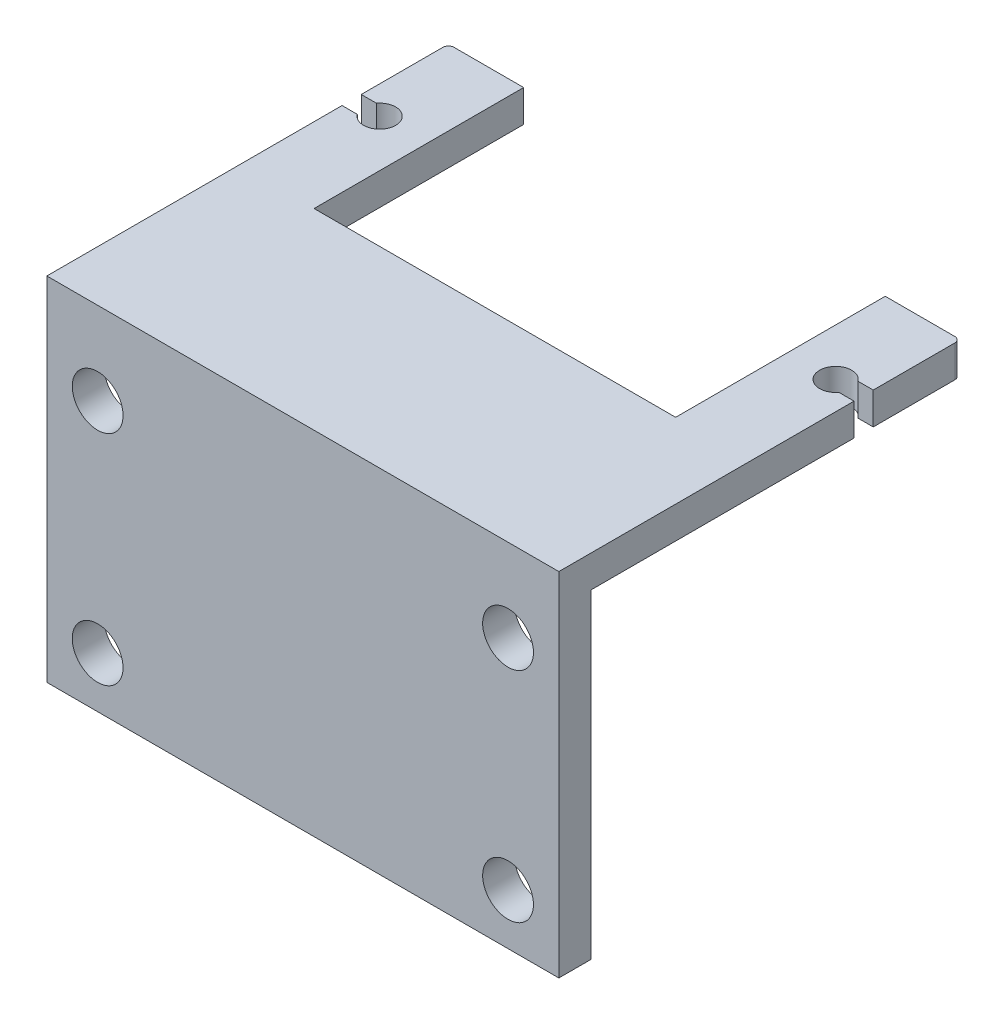
ISO-10303-21;
HEADER;
FILE_DESCRIPTION(('STEP AP214'),'2;1');
FILE_NAME('part.step','',(''),(''),'','','');
FILE_SCHEMA(('AUTOMOTIVE_DESIGN { 1 0 10303 214 1 1 1 1 }'));
ENDSEC;
DATA;
#1=APPLICATION_CONTEXT('core data for automotive mechanical design processes');
#2=APPLICATION_PROTOCOL_DEFINITION('international standard','automotive_design',2000,#1);
#3=PRODUCT_CONTEXT('',#1,'mechanical');
#4=PRODUCT('Part','Part','',(#3));
#5=PRODUCT_RELATED_PRODUCT_CATEGORY('part','',(#4));
#6=PRODUCT_DEFINITION_FORMATION('','',#4);
#7=PRODUCT_DEFINITION_CONTEXT('part definition',#1,'design');
#8=PRODUCT_DEFINITION('design','',#6,#7);
#9=PRODUCT_DEFINITION_SHAPE('','',#8);
#10=(LENGTH_UNIT() NAMED_UNIT(*) SI_UNIT(.MILLI.,.METRE.));
#11=(NAMED_UNIT(*) PLANE_ANGLE_UNIT() SI_UNIT($,.RADIAN.));
#12=(NAMED_UNIT(*) SI_UNIT($,.STERADIAN.) SOLID_ANGLE_UNIT());
#13=UNCERTAINTY_MEASURE_WITH_UNIT(LENGTH_MEASURE(1.E-05),#10,'distance_accuracy_value','');
#14=(GEOMETRIC_REPRESENTATION_CONTEXT(3) GLOBAL_UNCERTAINTY_ASSIGNED_CONTEXT((#13)) GLOBAL_UNIT_ASSIGNED_CONTEXT((#10,
#11,#12)) REPRESENTATION_CONTEXT('',''));
#15=CARTESIAN_POINT('',(0.,0.,0.));
#16=DIRECTION('',(0.,0.,1.));
#17=DIRECTION('',(1.,0.,0.));
#18=AXIS2_PLACEMENT_3D('',#15,#16,#17);
#19=CARTESIAN_POINT('',(-16.15,12.0772170092383,-0.6));
#20=DIRECTION('',(0.,0.,-1.));
#21=DIRECTION('',(-1.,0.,0.));
#22=AXIS2_PLACEMENT_3D('',#19,#20,#21);
#23=PLANE('',#22);
#24=DIRECTION('',(0.,-1.,0.));
#25=VECTOR('',#24,1.);
#26=CARTESIAN_POINT('',(-16.,20.2,-0.6));
#27=LINE('',#26,#25);
#28=CARTESIAN_POINT('',(-16.,20.2,-0.6));
#29=VERTEX_POINT('',#28);
#30=CARTESIAN_POINT('',(-16.,18.2,-0.6));
#31=VERTEX_POINT('',#30);
#32=EDGE_CURVE('E256',#29,#31,#27,.T.);
#33=ORIENTED_EDGE('',*,*,#32,.T.);
#34=DIRECTION('',(1.,0.,0.));
#35=VECTOR('',#34,1.);
#36=CARTESIAN_POINT('',(-16.15,18.2,-0.6));
#37=LINE('',#36,#35);
#38=CARTESIAN_POINT('',(-15.05,18.2,-0.6));
#39=VERTEX_POINT('',#38);
#40=EDGE_CURVE('E212',#31,#39,#37,.T.);
#41=ORIENTED_EDGE('',*,*,#40,.T.);
#42=DIRECTION('',(0.,1.,0.));
#43=VECTOR('',#42,1.);
#44=CARTESIAN_POINT('',(-15.05,12.0772170092383,-0.6));
#45=LINE('',#44,#43);
#46=CARTESIAN_POINT('',(-15.05,20.2,-0.6));
#47=VERTEX_POINT('',#46);
#48=EDGE_CURVE('E62',#39,#47,#45,.T.);
#49=ORIENTED_EDGE('',*,*,#48,.T.);
#50=DIRECTION('',(1.,0.,0.));
#51=VECTOR('',#50,1.);
#52=CARTESIAN_POINT('',(-16.,20.2,-0.6));
#53=LINE('',#52,#51);
#54=EDGE_CURVE('E253',#29,#47,#53,.T.);
#55=ORIENTED_EDGE('',*,*,#54,.F.);
#56=EDGE_LOOP('',(#33,#41,#49,#55));
#57=FACE_BOUND('',#56,.T.);
#58=ADVANCED_FACE('F44',(#57),#23,.F.);
#59=CARTESIAN_POINT('',(-14.25,12.0772170092383,0.));
#60=DIRECTION('',(0.,1.,0.));
#61=DIRECTION('',(0.,0.,1.));
#62=AXIS2_PLACEMENT_3D('',#59,#60,#61);
#63=CYLINDRICAL_SURFACE('',#62,1.);
#64=ORIENTED_EDGE('',*,*,#48,.F.);
#65=CARTESIAN_POINT('',(-14.25,18.2,0.));
#66=DIRECTION('',(0.,1.,0.));
#67=DIRECTION('',(0.,0.,1.));
#68=AXIS2_PLACEMENT_3D('',#65,#66,#67);
#69=CIRCLE('',#68,1.);
#70=CARTESIAN_POINT('',(-15.05,18.2,0.6));
#71=VERTEX_POINT('',#70);
#72=EDGE_CURVE('E223',#39,#71,#69,.F.);
#73=ORIENTED_EDGE('',*,*,#72,.T.);
#74=DIRECTION('',(0.,1.,0.));
#75=VECTOR('',#74,1.);
#76=CARTESIAN_POINT('',(-15.05,12.0772170092383,0.6));
#77=LINE('',#76,#75);
#78=CARTESIAN_POINT('',(-15.05,20.2,0.6));
#79=VERTEX_POINT('',#78);
#80=EDGE_CURVE('E276',#71,#79,#77,.T.);
#81=ORIENTED_EDGE('',*,*,#80,.T.);
#82=CARTESIAN_POINT('',(-14.25,20.2,0.));
#83=DIRECTION('',(0.,-1.,0.));
#84=DIRECTION('',(0.,0.,1.));
#85=AXIS2_PLACEMENT_3D('',#82,#83,#84);
#86=CIRCLE('',#85,1.);
#87=EDGE_CURVE('E231',#47,#79,#86,.T.);
#88=ORIENTED_EDGE('',*,*,#87,.F.);
#89=EDGE_LOOP('',(#64,#73,#81,#88));
#90=FACE_BOUND('',#89,.T.);
#91=ADVANCED_FACE('F302',(#90),#63,.F.);
#92=CARTESIAN_POINT('',(-16.15,12.0772170092383,0.6));
#93=DIRECTION('',(0.,0.,1.));
#94=DIRECTION('',(1.,0.,0.));
#95=AXIS2_PLACEMENT_3D('',#92,#93,#94);
#96=PLANE('',#95);
#97=ORIENTED_EDGE('',*,*,#80,.F.);
#98=DIRECTION('',(-1.,0.,0.));
#99=VECTOR('',#98,1.);
#100=CARTESIAN_POINT('',(-16.15,18.2,0.6));
#101=LINE('',#100,#99);
#102=CARTESIAN_POINT('',(-16.,18.2,0.6));
#103=VERTEX_POINT('',#102);
#104=EDGE_CURVE('E227',#71,#103,#101,.T.);
#105=ORIENTED_EDGE('',*,*,#104,.T.);
#106=DIRECTION('',(0.,-1.,0.));
#107=VECTOR('',#106,1.);
#108=CARTESIAN_POINT('',(-16.,20.2,0.6));
#109=LINE('',#108,#107);
#110=CARTESIAN_POINT('',(-16.,20.2,0.6));
#111=VERTEX_POINT('',#110);
#112=EDGE_CURVE('E272',#111,#103,#109,.T.);
#113=ORIENTED_EDGE('',*,*,#112,.F.);
#114=DIRECTION('',(-1.,0.,0.));
#115=VECTOR('',#114,1.);
#116=CARTESIAN_POINT('',(-15.05,20.2,0.6));
#117=LINE('',#116,#115);
#118=EDGE_CURVE('E235',#79,#111,#117,.T.);
#119=ORIENTED_EDGE('',*,*,#118,.F.);
#120=EDGE_LOOP('',(#97,#105,#113,#119));
#121=FACE_BOUND('',#120,.T.);
#122=ADVANCED_FACE('F46',(#121),#96,.F.);
#123=CARTESIAN_POINT('',(-11.3,16.6,-6.05));
#124=DIRECTION('',(-1.,0.,0.));
#125=DIRECTION('',(0.,0.,1.));
#126=AXIS2_PLACEMENT_3D('',#123,#124,#125);
#127=PLANE('',#126);
#128=DIRECTION('',(0.,0.,-1.));
#129=VECTOR('',#128,1.);
#130=CARTESIAN_POINT('',(-11.3,20.2,6.05));
#131=LINE('',#130,#129);
#132=CARTESIAN_POINT('',(-11.3,20.2,7.05));
#133=VERTEX_POINT('',#132);
#134=CARTESIAN_POINT('',(-11.3,20.2,-6.05));
#135=VERTEX_POINT('',#134);
#136=EDGE_CURVE('E241',#133,#135,#131,.T.);
#137=ORIENTED_EDGE('',*,*,#136,.F.);
#138=DIRECTION('',(0.,1.,0.));
#139=VECTOR('',#138,1.);
#140=CARTESIAN_POINT('',(-11.3,18.2,7.05));
#141=LINE('',#140,#139);
#142=CARTESIAN_POINT('',(-11.3,18.2,7.05));
#143=VERTEX_POINT('',#142);
#144=EDGE_CURVE('E339',#143,#133,#141,.T.);
#145=ORIENTED_EDGE('',*,*,#144,.F.);
#146=DIRECTION('',(0.,0.,-1.));
#147=VECTOR('',#146,1.);
#148=CARTESIAN_POINT('',(-11.3,18.2,-6.05));
#149=LINE('',#148,#147);
#150=CARTESIAN_POINT('',(-11.3,18.2,-6.05));
#151=VERTEX_POINT('',#150);
#152=EDGE_CURVE('E207',#143,#151,#149,.T.);
#153=ORIENTED_EDGE('',*,*,#152,.T.);
#154=DIRECTION('',(0.,-1.,0.));
#155=VECTOR('',#154,1.);
#156=CARTESIAN_POINT('',(-11.3,20.2,-6.05));
#157=LINE('',#156,#155);
#158=EDGE_CURVE('E268',#135,#151,#157,.T.);
#159=ORIENTED_EDGE('',*,*,#158,.F.);
#160=EDGE_LOOP('',(#137,#145,#153,#159));
#161=FACE_BOUND('',#160,.T.);
#162=ADVANCED_FACE('F461',(#161),#127,.F.);
#163=CARTESIAN_POINT('',(-16.,20.2,0.6));
#164=DIRECTION('',(1.,0.,0.));
#165=DIRECTION('',(0.,0.,-1.));
#166=AXIS2_PLACEMENT_3D('',#163,#164,#165);
#167=PLANE('',#166);
#168=DIRECTION('',(0.,0.,1.));
#169=VECTOR('',#168,1.);
#170=CARTESIAN_POINT('',(-16.,18.2,5.7));
#171=LINE('',#170,#169);
#172=CARTESIAN_POINT('',(-16.,18.2,17.05));
#173=VERTEX_POINT('',#172);
#174=EDGE_CURVE('E11',#103,#173,#171,.T.);
#175=ORIENTED_EDGE('',*,*,#174,.T.);
#176=DIRECTION('',(0.,1.,0.));
#177=VECTOR('',#176,1.);
#178=CARTESIAN_POINT('',(-16.,18.2,17.05));
#179=LINE('',#178,#177);
#180=CARTESIAN_POINT('',(-16.,-1.8,17.05));
#181=VERTEX_POINT('',#180);
#182=EDGE_CURVE('E191',#181,#173,#179,.T.);
#183=ORIENTED_EDGE('',*,*,#182,.F.);
#184=DIRECTION('',(0.,0.,1.));
#185=VECTOR('',#184,1.);
#186=CARTESIAN_POINT('',(-16.,-1.8,6.05));
#187=LINE('',#186,#185);
#188=CARTESIAN_POINT('',(-16.,-1.8,19.05));
#189=VERTEX_POINT('',#188);
#190=EDGE_CURVE('E199',#181,#189,#187,.T.);
#191=ORIENTED_EDGE('',*,*,#190,.T.);
#192=DIRECTION('',(0.,-1.,0.));
#193=VECTOR('',#192,1.);
#194=CARTESIAN_POINT('',(-16.,20.2,19.05));
#195=LINE('',#194,#193);
#196=CARTESIAN_POINT('',(-16.,20.2,19.05));
#197=VERTEX_POINT('',#196);
#198=EDGE_CURVE('E317',#197,#189,#195,.T.);
#199=ORIENTED_EDGE('',*,*,#198,.F.);
#200=DIRECTION('',(0.,0.,1.));
#201=VECTOR('',#200,1.);
#202=CARTESIAN_POINT('',(-16.,20.2,0.6));
#203=LINE('',#202,#201);
#204=EDGE_CURVE('E238',#111,#197,#203,.T.);
#205=ORIENTED_EDGE('',*,*,#204,.F.);
#206=ORIENTED_EDGE('',*,*,#112,.T.);
#207=EDGE_LOOP('',(#175,#183,#191,#199,#205,#206));
#208=FACE_BOUND('',#207,.T.);
#209=ADVANCED_FACE('F321',(#208),#167,.F.);
#210=CARTESIAN_POINT('',(-11.3,20.2,-6.05));
#211=DIRECTION('',(0.,0.,1.));
#212=DIRECTION('',(1.,0.,0.));
#213=AXIS2_PLACEMENT_3D('',#210,#211,#212);
#214=PLANE('',#213);
#215=DIRECTION('',(-1.,0.,0.));
#216=VECTOR('',#215,1.);
#217=CARTESIAN_POINT('',(-15.65,18.2,-6.05));
#218=LINE('',#217,#216);
#219=CARTESIAN_POINT('',(-15.65,18.2,-6.05));
#220=VERTEX_POINT('',#219);
#221=EDGE_CURVE('E279',#151,#220,#218,.T.);
#222=ORIENTED_EDGE('',*,*,#221,.T.);
#223=DIRECTION('',(0.,-1.,0.));
#224=VECTOR('',#223,1.);
#225=CARTESIAN_POINT('',(-15.65,20.2,-6.05));
#226=LINE('',#225,#224);
#227=CARTESIAN_POINT('',(-15.65,20.2,-6.05));
#228=VERTEX_POINT('',#227);
#229=EDGE_CURVE('E264',#228,#220,#226,.T.);
#230=ORIENTED_EDGE('',*,*,#229,.F.);
#231=DIRECTION('',(-1.,0.,0.));
#232=VECTOR('',#231,1.);
#233=CARTESIAN_POINT('',(-11.3,20.2,-6.05));
#234=LINE('',#233,#232);
#235=EDGE_CURVE('E244',#135,#228,#234,.T.);
#236=ORIENTED_EDGE('',*,*,#235,.F.);
#237=ORIENTED_EDGE('',*,*,#158,.T.);
#238=EDGE_LOOP('',(#222,#230,#236,#237));
#239=FACE_BOUND('',#238,.T.);
#240=ADVANCED_FACE('F467',(#239),#214,.F.);
#241=CARTESIAN_POINT('',(-15.65,20.2,-5.7));
#242=DIRECTION('',(0.,-1.,0.));
#243=DIRECTION('',(0.,0.,-1.));
#244=AXIS2_PLACEMENT_3D('',#241,#242,#243);
#245=CYLINDRICAL_SURFACE('',#244,0.35);
#246=CARTESIAN_POINT('',(-15.65,18.2,-5.7));
#247=DIRECTION('',(0.,1.,0.));
#248=DIRECTION('',(0.,0.,1.));
#249=AXIS2_PLACEMENT_3D('',#246,#247,#248);
#250=CIRCLE('',#249,0.35);
#251=CARTESIAN_POINT('',(-16.,18.2,-5.7));
#252=VERTEX_POINT('',#251);
#253=EDGE_CURVE('E285',#220,#252,#250,.T.);
#254=ORIENTED_EDGE('',*,*,#253,.T.);
#255=DIRECTION('',(0.,-1.,0.));
#256=VECTOR('',#255,1.);
#257=CARTESIAN_POINT('',(-16.,20.2,-5.7));
#258=LINE('',#257,#256);
#259=CARTESIAN_POINT('',(-16.,20.2,-5.7));
#260=VERTEX_POINT('',#259);
#261=EDGE_CURVE('E260',#260,#252,#258,.T.);
#262=ORIENTED_EDGE('',*,*,#261,.F.);
#263=CARTESIAN_POINT('',(-15.65,20.2,-5.7));
#264=DIRECTION('',(0.,1.,0.));
#265=DIRECTION('',(0.,0.,1.));
#266=AXIS2_PLACEMENT_3D('',#263,#264,#265);
#267=CIRCLE('',#266,0.35);
#268=EDGE_CURVE('E247',#228,#260,#267,.T.);
#269=ORIENTED_EDGE('',*,*,#268,.F.);
#270=ORIENTED_EDGE('',*,*,#229,.T.);
#271=EDGE_LOOP('',(#254,#262,#269,#270));
#272=FACE_BOUND('',#271,.T.);
#273=ADVANCED_FACE('F469',(#272),#245,.T.);
#274=CARTESIAN_POINT('',(-16.,20.2,-5.7));
#275=DIRECTION('',(1.,0.,0.));
#276=DIRECTION('',(0.,0.,-1.));
#277=AXIS2_PLACEMENT_3D('',#274,#275,#276);
#278=PLANE('',#277);
#279=DIRECTION('',(0.,0.,1.));
#280=VECTOR('',#279,1.);
#281=CARTESIAN_POINT('',(-16.,18.2,-0.6));
#282=LINE('',#281,#280);
#283=EDGE_CURVE('E55',#252,#31,#282,.T.);
#284=ORIENTED_EDGE('',*,*,#283,.T.);
#285=ORIENTED_EDGE('',*,*,#32,.F.);
#286=DIRECTION('',(0.,0.,1.));
#287=VECTOR('',#286,1.);
#288=CARTESIAN_POINT('',(-16.,20.2,-5.7));
#289=LINE('',#288,#287);
#290=EDGE_CURVE('E250',#260,#29,#289,.T.);
#291=ORIENTED_EDGE('',*,*,#290,.F.);
#292=ORIENTED_EDGE('',*,*,#261,.T.);
#293=EDGE_LOOP('',(#284,#285,#291,#292));
#294=FACE_BOUND('',#293,.T.);
#295=ADVANCED_FACE('F293',(#294),#278,.F.);
#296=CARTESIAN_POINT('',(-14.25,20.2,0.));
#297=DIRECTION('',(0.,1.,0.));
#298=DIRECTION('',(0.,0.,1.));
#299=AXIS2_PLACEMENT_3D('',#296,#297,#298);
#300=PLANE('',#299);
#301=DIRECTION('',(0.,0.,1.));
#302=VECTOR('',#301,1.);
#303=CARTESIAN_POINT('',(11.3,20.2,-6.05));
#304=LINE('',#303,#302);
#305=CARTESIAN_POINT('',(11.3,20.2,-6.05));
#306=VERTEX_POINT('',#305);
#307=CARTESIAN_POINT('',(11.3,20.2,7.05));
#308=VERTEX_POINT('',#307);
#309=EDGE_CURVE('E367',#306,#308,#304,.T.);
#310=ORIENTED_EDGE('',*,*,#309,.T.);
#311=DIRECTION('',(1.,0.,0.));
#312=VECTOR('',#311,1.);
#313=CARTESIAN_POINT('',(-11.3,20.2,7.05));
#314=LINE('',#313,#312);
#315=EDGE_CURVE('E343',#133,#308,#314,.T.);
#316=ORIENTED_EDGE('',*,*,#315,.F.);
#317=ORIENTED_EDGE('',*,*,#136,.T.);
#318=ORIENTED_EDGE('',*,*,#235,.T.);
#319=ORIENTED_EDGE('',*,*,#268,.T.);
#320=ORIENTED_EDGE('',*,*,#290,.T.);
#321=ORIENTED_EDGE('',*,*,#54,.T.);
#322=ORIENTED_EDGE('',*,*,#87,.T.);
#323=ORIENTED_EDGE('',*,*,#118,.T.);
#324=ORIENTED_EDGE('',*,*,#204,.T.);
#325=DIRECTION('',(-1.,0.,0.));
#326=VECTOR('',#325,1.);
#327=CARTESIAN_POINT('',(-16.,20.2,19.05));
#328=LINE('',#327,#326);
#329=CARTESIAN_POINT('',(16.,20.2,19.05));
#330=VERTEX_POINT('',#329);
#331=EDGE_CURVE('E310',#330,#197,#328,.T.);
#332=ORIENTED_EDGE('',*,*,#331,.F.);
#333=DIRECTION('',(0.,0.,-1.));
#334=VECTOR('',#333,1.);
#335=CARTESIAN_POINT('',(16.,20.2,6.05));
#336=LINE('',#335,#334);
#337=CARTESIAN_POINT('',(16.,20.2,0.599999999999996));
#338=VERTEX_POINT('',#337);
#339=EDGE_CURVE('E214',#330,#338,#336,.T.);
#340=ORIENTED_EDGE('',*,*,#339,.T.);
#341=DIRECTION('',(-1.,0.,0.));
#342=VECTOR('',#341,1.);
#343=CARTESIAN_POINT('',(16.,20.2,0.599999999999996));
#344=LINE('',#343,#342);
#345=CARTESIAN_POINT('',(15.05,20.2,0.599999999999995));
#346=VERTEX_POINT('',#345);
#347=EDGE_CURVE('E370',#338,#346,#344,.T.);
#348=ORIENTED_EDGE('',*,*,#347,.T.);
#349=CARTESIAN_POINT('',(14.25,20.2,0.));
#350=DIRECTION('',(0.,-1.,0.));
#351=DIRECTION('',(0.,0.,1.));
#352=AXIS2_PLACEMENT_3D('',#349,#350,#351);
#353=CIRCLE('',#352,0.999999999999997);
#354=CARTESIAN_POINT('',(15.05,20.2,-0.599999999999998));
#355=VERTEX_POINT('',#354);
#356=EDGE_CURVE('E374',#346,#355,#353,.T.);
#357=ORIENTED_EDGE('',*,*,#356,.T.);
#358=DIRECTION('',(1.,0.,0.));
#359=VECTOR('',#358,1.);
#360=CARTESIAN_POINT('',(15.05,20.2,-0.599999999999997));
#361=LINE('',#360,#359);
#362=CARTESIAN_POINT('',(16.,20.2,-0.599999999999996));
#363=VERTEX_POINT('',#362);
#364=EDGE_CURVE('E378',#355,#363,#361,.T.);
#365=ORIENTED_EDGE('',*,*,#364,.T.);
#366=DIRECTION('',(0.,0.,-1.));
#367=VECTOR('',#366,1.);
#368=CARTESIAN_POINT('',(16.,20.2,-0.599999999999996));
#369=LINE('',#368,#367);
#370=CARTESIAN_POINT('',(16.,20.2,-5.7));
#371=VERTEX_POINT('',#370);
#372=EDGE_CURVE('E381',#363,#371,#369,.T.);
#373=ORIENTED_EDGE('',*,*,#372,.T.);
#374=CARTESIAN_POINT('',(15.65,20.2,-5.7));
#375=DIRECTION('',(0.,1.,0.));
#376=DIRECTION('',(0.,0.,1.));
#377=AXIS2_PLACEMENT_3D('',#374,#375,#376);
#378=CIRCLE('',#377,0.35);
#379=CARTESIAN_POINT('',(15.65,20.2,-6.05));
#380=VERTEX_POINT('',#379);
#381=EDGE_CURVE('E384',#371,#380,#378,.T.);
#382=ORIENTED_EDGE('',*,*,#381,.T.);
#383=DIRECTION('',(-1.,0.,0.));
#384=VECTOR('',#383,1.);
#385=CARTESIAN_POINT('',(15.65,20.2,-6.05));
#386=LINE('',#385,#384);
#387=EDGE_CURVE('E363',#380,#306,#386,.T.);
#388=ORIENTED_EDGE('',*,*,#387,.T.);
#389=EDGE_LOOP('',(#310,#316,#317,#318,#319,#320,#321,#322,#323,#324,#332,#340,#348,#357,#365,
#373,#382,#388));
#390=FACE_BOUND('',#389,.T.);
#391=ADVANCED_FACE('F300',(#390),#300,.T.);
#392=CARTESIAN_POINT('',(0.,18.2,0.));
#393=DIRECTION('',(0.,1.,0.));
#394=DIRECTION('',(0.,0.,1.));
#395=AXIS2_PLACEMENT_3D('',#392,#393,#394);
#396=PLANE('',#395);
#397=ORIENTED_EDGE('',*,*,#152,.F.);
#398=DIRECTION('',(-1.,0.,0.));
#399=VECTOR('',#398,1.);
#400=CARTESIAN_POINT('',(16.,18.2,7.05));
#401=LINE('',#400,#399);
#402=CARTESIAN_POINT('',(11.3,18.2,7.05));
#403=VERTEX_POINT('',#402);
#404=EDGE_CURVE('E458',#403,#143,#401,.T.);
#405=ORIENTED_EDGE('',*,*,#404,.F.);
#406=DIRECTION('',(0.,0.,1.));
#407=VECTOR('',#406,1.);
#408=CARTESIAN_POINT('',(11.3,18.2,6.05));
#409=LINE('',#408,#407);
#410=CARTESIAN_POINT('',(11.3,18.2,-6.05));
#411=VERTEX_POINT('',#410);
#412=EDGE_CURVE('E347',#411,#403,#409,.T.);
#413=ORIENTED_EDGE('',*,*,#412,.F.);
#414=DIRECTION('',(-1.,0.,0.));
#415=VECTOR('',#414,1.);
#416=CARTESIAN_POINT('',(11.3,18.2,-6.05));
#417=LINE('',#416,#415);
#418=CARTESIAN_POINT('',(15.65,18.2,-6.05));
#419=VERTEX_POINT('',#418);
#420=EDGE_CURVE('E219',#419,#411,#417,.T.);
#421=ORIENTED_EDGE('',*,*,#420,.F.);
#422=CARTESIAN_POINT('',(15.65,18.2,-5.7));
#423=DIRECTION('',(0.,1.,0.));
#424=DIRECTION('',(0.,0.,1.));
#425=AXIS2_PLACEMENT_3D('',#422,#423,#424);
#426=CIRCLE('',#425,0.35);
#427=CARTESIAN_POINT('',(16.,18.2,-5.7));
#428=VERTEX_POINT('',#427);
#429=EDGE_CURVE('E416',#428,#419,#426,.T.);
#430=ORIENTED_EDGE('',*,*,#429,.F.);
#431=DIRECTION('',(0.,0.,-1.));
#432=VECTOR('',#431,1.);
#433=CARTESIAN_POINT('',(16.,18.2,-5.7));
#434=LINE('',#433,#432);
#435=CARTESIAN_POINT('',(16.,18.2,-0.599999999999996));
#436=VERTEX_POINT('',#435);
#437=EDGE_CURVE('E411',#436,#428,#434,.T.);
#438=ORIENTED_EDGE('',*,*,#437,.F.);
#439=DIRECTION('',(1.,0.,0.));
#440=VECTOR('',#439,1.);
#441=CARTESIAN_POINT('',(16.15,18.2,-0.599999999999996));
#442=LINE('',#441,#440);
#443=CARTESIAN_POINT('',(15.05,18.2,-0.599999999999998));
#444=VERTEX_POINT('',#443);
#445=EDGE_CURVE('E359',#444,#436,#442,.T.);
#446=ORIENTED_EDGE('',*,*,#445,.F.);
#447=CARTESIAN_POINT('',(14.25,18.2,0.));
#448=DIRECTION('',(0.,1.,0.));
#449=DIRECTION('',(0.,0.,1.));
#450=AXIS2_PLACEMENT_3D('',#447,#448,#449);
#451=CIRCLE('',#450,0.999999999999998);
#452=CARTESIAN_POINT('',(15.05,18.2,0.599999999999996));
#453=VERTEX_POINT('',#452);
#454=EDGE_CURVE('E355',#453,#444,#451,.F.);
#455=ORIENTED_EDGE('',*,*,#454,.F.);
#456=DIRECTION('',(-1.,0.,0.));
#457=VECTOR('',#456,1.);
#458=CARTESIAN_POINT('',(16.15,18.2,0.599999999999996));
#459=LINE('',#458,#457);
#460=CARTESIAN_POINT('',(16.,18.2,0.599999999999996));
#461=VERTEX_POINT('',#460);
#462=EDGE_CURVE('E351',#461,#453,#459,.T.);
#463=ORIENTED_EDGE('',*,*,#462,.F.);
#464=DIRECTION('',(0.,0.,-1.));
#465=VECTOR('',#464,1.);
#466=CARTESIAN_POINT('',(16.,18.2,0.599999999999996));
#467=LINE('',#466,#465);
#468=CARTESIAN_POINT('',(16.,18.2,17.05));
#469=VERTEX_POINT('',#468);
#470=EDGE_CURVE('E408',#469,#461,#467,.T.);
#471=ORIENTED_EDGE('',*,*,#470,.F.);
#472=DIRECTION('',(-1.,0.,0.));
#473=VECTOR('',#472,1.);
#474=CARTESIAN_POINT('',(16.,18.2,17.05));
#475=LINE('',#474,#473);
#476=EDGE_CURVE('E187',#469,#173,#475,.T.);
#477=ORIENTED_EDGE('',*,*,#476,.T.);
#478=ORIENTED_EDGE('',*,*,#174,.F.);
#479=ORIENTED_EDGE('',*,*,#104,.F.);
#480=ORIENTED_EDGE('',*,*,#72,.F.);
#481=ORIENTED_EDGE('',*,*,#40,.F.);
#482=ORIENTED_EDGE('',*,*,#283,.F.);
#483=ORIENTED_EDGE('',*,*,#253,.F.);
#484=ORIENTED_EDGE('',*,*,#221,.F.);
#485=EDGE_LOOP('',(#397,#405,#413,#421,#430,#438,#446,#455,#463,#471,#477,#478,#479,#480,#481,
#482,#483,#484));
#486=FACE_BOUND('',#485,.T.);
#487=ADVANCED_FACE('F470',(#486),#396,.F.);
#488=CARTESIAN_POINT('',(16.,-1.8,6.05));
#489=DIRECTION('',(1.,0.,0.));
#490=DIRECTION('',(0.,0.,-1.));
#491=AXIS2_PLACEMENT_3D('',#488,#489,#490);
#492=PLANE('',#491);
#493=DIRECTION('',(0.,1.,0.));
#494=VECTOR('',#493,1.);
#495=CARTESIAN_POINT('',(16.,18.2,17.05));
#496=LINE('',#495,#494);
#497=CARTESIAN_POINT('',(16.,-1.8,17.05));
#498=VERTEX_POINT('',#497);
#499=EDGE_CURVE('E179',#498,#469,#496,.T.);
#500=ORIENTED_EDGE('',*,*,#499,.T.);
#501=ORIENTED_EDGE('',*,*,#470,.T.);
#502=DIRECTION('',(0.,-1.,0.));
#503=VECTOR('',#502,1.);
#504=CARTESIAN_POINT('',(16.,20.2,0.599999999999996));
#505=LINE('',#504,#503);
#506=EDGE_CURVE('E399',#338,#461,#505,.T.);
#507=ORIENTED_EDGE('',*,*,#506,.F.);
#508=ORIENTED_EDGE('',*,*,#339,.F.);
#509=DIRECTION('',(0.,1.,0.));
#510=VECTOR('',#509,1.);
#511=CARTESIAN_POINT('',(16.,20.2,19.05));
#512=LINE('',#511,#510);
#513=CARTESIAN_POINT('',(16.,-1.8,19.05));
#514=VERTEX_POINT('',#513);
#515=EDGE_CURVE('E205',#514,#330,#512,.T.);
#516=ORIENTED_EDGE('',*,*,#515,.F.);
#517=DIRECTION('',(0.,0.,-1.));
#518=VECTOR('',#517,1.);
#519=CARTESIAN_POINT('',(16.,-1.8,6.05));
#520=LINE('',#519,#518);
#521=EDGE_CURVE('E197',#514,#498,#520,.T.);
#522=ORIENTED_EDGE('',*,*,#521,.T.);
#523=EDGE_LOOP('',(#500,#501,#507,#508,#516,#522));
#524=FACE_BOUND('',#523,.T.);
#525=ADVANCED_FACE('F203',(#524),#492,.T.);
#526=CARTESIAN_POINT('',(0.,-1.8,0.));
#527=DIRECTION('',(0.,1.,0.));
#528=DIRECTION('',(0.,0.,1.));
#529=AXIS2_PLACEMENT_3D('',#526,#527,#528);
#530=PLANE('',#529);
#531=ORIENTED_EDGE('',*,*,#190,.F.);
#532=DIRECTION('',(-1.,0.,0.));
#533=VECTOR('',#532,1.);
#534=CARTESIAN_POINT('',(16.,-1.8,17.05));
#535=LINE('',#534,#533);
#536=EDGE_CURVE('E184',#498,#181,#535,.T.);
#537=ORIENTED_EDGE('',*,*,#536,.F.);
#538=ORIENTED_EDGE('',*,*,#521,.F.);
#539=DIRECTION('',(1.,0.,0.));
#540=VECTOR('',#539,1.);
#541=CARTESIAN_POINT('',(-16.,-1.8,19.05));
#542=LINE('',#541,#540);
#543=EDGE_CURVE('E323',#189,#514,#542,.T.);
#544=ORIENTED_EDGE('',*,*,#543,.F.);
#545=EDGE_LOOP('',(#531,#537,#538,#544));
#546=FACE_BOUND('',#545,.T.);
#547=ADVANCED_FACE('F195',(#546),#530,.F.);
#548=CARTESIAN_POINT('',(16.15,12.0772170092383,0.599999999999996));
#549=DIRECTION('',(0.,0.,1.));
#550=DIRECTION('',(1.,0.,0.));
#551=AXIS2_PLACEMENT_3D('',#548,#549,#550);
#552=PLANE('',#551);
#553=ORIENTED_EDGE('',*,*,#506,.T.);
#554=ORIENTED_EDGE('',*,*,#462,.T.);
#555=DIRECTION('',(0.,1.,0.));
#556=VECTOR('',#555,1.);
#557=CARTESIAN_POINT('',(15.05,12.0772170092383,0.599999999999995));
#558=LINE('',#557,#556);
#559=EDGE_CURVE('E407',#453,#346,#558,.T.);
#560=ORIENTED_EDGE('',*,*,#559,.T.);
#561=ORIENTED_EDGE('',*,*,#347,.F.);
#562=EDGE_LOOP('',(#553,#554,#560,#561));
#563=FACE_BOUND('',#562,.T.);
#564=ADVANCED_FACE('F428',(#563),#552,.F.);
#565=CARTESIAN_POINT('',(14.25,12.0772170092383,0.));
#566=DIRECTION('',(0.,1.,0.));
#567=DIRECTION('',(0.,0.,1.));
#568=AXIS2_PLACEMENT_3D('',#565,#566,#567);
#569=CYLINDRICAL_SURFACE('',#568,0.999999999999998);
#570=ORIENTED_EDGE('',*,*,#559,.F.);
#571=ORIENTED_EDGE('',*,*,#454,.T.);
#572=DIRECTION('',(0.,1.,0.));
#573=VECTOR('',#572,1.);
#574=CARTESIAN_POINT('',(15.05,12.0772170092383,-0.599999999999996));
#575=LINE('',#574,#573);
#576=EDGE_CURVE('E412',#444,#355,#575,.T.);
#577=ORIENTED_EDGE('',*,*,#576,.T.);
#578=ORIENTED_EDGE('',*,*,#356,.F.);
#579=EDGE_LOOP('',(#570,#571,#577,#578));
#580=FACE_BOUND('',#579,.T.);
#581=ADVANCED_FACE('F434',(#580),#569,.F.);
#582=CARTESIAN_POINT('',(16.15,12.0772170092383,-0.599999999999996));
#583=DIRECTION('',(0.,0.,-1.));
#584=DIRECTION('',(-1.,0.,0.));
#585=AXIS2_PLACEMENT_3D('',#582,#583,#584);
#586=PLANE('',#585);
#587=ORIENTED_EDGE('',*,*,#576,.F.);
#588=ORIENTED_EDGE('',*,*,#445,.T.);
#589=DIRECTION('',(0.,-1.,0.));
#590=VECTOR('',#589,1.);
#591=CARTESIAN_POINT('',(16.,20.2,-0.599999999999996));
#592=LINE('',#591,#590);
#593=EDGE_CURVE('E395',#363,#436,#592,.T.);
#594=ORIENTED_EDGE('',*,*,#593,.F.);
#595=ORIENTED_EDGE('',*,*,#364,.F.);
#596=EDGE_LOOP('',(#587,#588,#594,#595));
#597=FACE_BOUND('',#596,.T.);
#598=ADVANCED_FACE('F437',(#597),#586,.F.);
#599=CARTESIAN_POINT('',(11.3,16.6,6.05));
#600=DIRECTION('',(1.,0.,0.));
#601=DIRECTION('',(0.,0.,-1.));
#602=AXIS2_PLACEMENT_3D('',#599,#600,#601);
#603=PLANE('',#602);
#604=DIRECTION('',(0.,-1.,0.));
#605=VECTOR('',#604,1.);
#606=CARTESIAN_POINT('',(11.3,20.2,-6.05));
#607=LINE('',#606,#605);
#608=EDGE_CURVE('E403',#306,#411,#607,.T.);
#609=ORIENTED_EDGE('',*,*,#608,.T.);
#610=ORIENTED_EDGE('',*,*,#412,.T.);
#611=DIRECTION('',(0.,-1.,0.));
#612=VECTOR('',#611,1.);
#613=CARTESIAN_POINT('',(11.3,20.2,7.05));
#614=LINE('',#613,#612);
#615=EDGE_CURVE('E319',#308,#403,#614,.T.);
#616=ORIENTED_EDGE('',*,*,#615,.F.);
#617=ORIENTED_EDGE('',*,*,#309,.F.);
#618=EDGE_LOOP('',(#609,#610,#616,#617));
#619=FACE_BOUND('',#618,.T.);
#620=ADVANCED_FACE('F454',(#619),#603,.F.);
#621=CARTESIAN_POINT('',(15.65,20.2,-6.05));
#622=DIRECTION('',(0.,0.,1.));
#623=DIRECTION('',(1.,0.,0.));
#624=AXIS2_PLACEMENT_3D('',#621,#622,#623);
#625=PLANE('',#624);
#626=ORIENTED_EDGE('',*,*,#420,.T.);
#627=ORIENTED_EDGE('',*,*,#608,.F.);
#628=ORIENTED_EDGE('',*,*,#387,.F.);
#629=DIRECTION('',(0.,-1.,0.));
#630=VECTOR('',#629,1.);
#631=CARTESIAN_POINT('',(15.65,20.2,-6.05));
#632=LINE('',#631,#630);
#633=EDGE_CURVE('E387',#380,#419,#632,.T.);
#634=ORIENTED_EDGE('',*,*,#633,.T.);
#635=EDGE_LOOP('',(#626,#627,#628,#634));
#636=FACE_BOUND('',#635,.T.);
#637=ADVANCED_FACE('F450',(#636),#625,.F.);
#638=CARTESIAN_POINT('',(16.,20.2,-0.599999999999996));
#639=DIRECTION('',(-1.,0.,0.));
#640=DIRECTION('',(0.,0.,1.));
#641=AXIS2_PLACEMENT_3D('',#638,#639,#640);
#642=PLANE('',#641);
#643=ORIENTED_EDGE('',*,*,#437,.T.);
#644=DIRECTION('',(0.,-1.,0.));
#645=VECTOR('',#644,1.);
#646=CARTESIAN_POINT('',(16.,20.2,-5.7));
#647=LINE('',#646,#645);
#648=EDGE_CURVE('E391',#371,#428,#647,.T.);
#649=ORIENTED_EDGE('',*,*,#648,.F.);
#650=ORIENTED_EDGE('',*,*,#372,.F.);
#651=ORIENTED_EDGE('',*,*,#593,.T.);
#652=EDGE_LOOP('',(#643,#649,#650,#651));
#653=FACE_BOUND('',#652,.T.);
#654=ADVANCED_FACE('F444',(#653),#642,.F.);
#655=CARTESIAN_POINT('',(15.65,20.2,-5.7));
#656=DIRECTION('',(0.,-1.,0.));
#657=DIRECTION('',(0.,0.,-1.));
#658=AXIS2_PLACEMENT_3D('',#655,#656,#657);
#659=CYLINDRICAL_SURFACE('',#658,0.35);
#660=ORIENTED_EDGE('',*,*,#429,.T.);
#661=ORIENTED_EDGE('',*,*,#633,.F.);
#662=ORIENTED_EDGE('',*,*,#381,.F.);
#663=ORIENTED_EDGE('',*,*,#648,.T.);
#664=EDGE_LOOP('',(#660,#661,#662,#663));
#665=FACE_BOUND('',#664,.T.);
#666=ADVANCED_FACE('F446',(#665),#659,.T.);
#667=CARTESIAN_POINT('',(12.825,1.375,9.05));
#668=DIRECTION('',(0.,0.,-1.));
#669=DIRECTION('',(-1.,0.,0.));
#670=AXIS2_PLACEMENT_3D('',#667,#668,#669);
#671=CYLINDRICAL_SURFACE('',#670,1.5875);
#672=CARTESIAN_POINT('',(12.825,1.375,17.05));
#673=DIRECTION('',(0.,0.,1.));
#674=DIRECTION('',(0.,-1.,0.));
#675=AXIS2_PLACEMENT_3D('',#672,#673,#674);
#676=CIRCLE('',#675,1.5875);
#677=CARTESIAN_POINT('',(12.825,-0.212499999999997,17.05));
#678=VERTEX_POINT('',#677);
#679=EDGE_CURVE('E487',#678,#678,#676,.F.);
#680=ORIENTED_EDGE('',*,*,#679,.T.);
#681=EDGE_LOOP('',(#680));
#682=FACE_BOUND('',#681,.T.);
#683=CARTESIAN_POINT('',(12.825,1.375,19.05));
#684=DIRECTION('',(0.,0.,1.));
#685=DIRECTION('',(1.,0.,0.));
#686=AXIS2_PLACEMENT_3D('',#683,#684,#685);
#687=CIRCLE('',#686,1.5875);
#688=CARTESIAN_POINT('',(14.4125,1.375,19.05));
#689=VERTEX_POINT('',#688);
#690=EDGE_CURVE('E324',#689,#689,#687,.T.);
#691=ORIENTED_EDGE('',*,*,#690,.T.);
#692=EDGE_LOOP('',(#691));
#693=FACE_BOUND('',#692,.T.);
#694=ADVANCED_FACE('F520',(#682,#693),#671,.F.);
#695=CARTESIAN_POINT('',(-12.825,1.375,9.05));
#696=DIRECTION('',(0.,0.,-1.));
#697=DIRECTION('',(-1.,0.,0.));
#698=AXIS2_PLACEMENT_3D('',#695,#696,#697);
#699=CYLINDRICAL_SURFACE('',#698,1.5875);
#700=CARTESIAN_POINT('',(-12.825,1.375,17.05));
#701=DIRECTION('',(0.,0.,1.));
#702=DIRECTION('',(0.,-1.,0.));
#703=AXIS2_PLACEMENT_3D('',#700,#701,#702);
#704=CIRCLE('',#703,1.5875);
#705=CARTESIAN_POINT('',(-12.825,-0.212499999999997,17.05));
#706=VERTEX_POINT('',#705);
#707=EDGE_CURVE('E483',#706,#706,#704,.F.);
#708=ORIENTED_EDGE('',*,*,#707,.T.);
#709=EDGE_LOOP('',(#708));
#710=FACE_BOUND('',#709,.T.);
#711=CARTESIAN_POINT('',(-12.825,1.375,19.05));
#712=DIRECTION('',(0.,0.,1.));
#713=DIRECTION('',(1.,0.,0.));
#714=AXIS2_PLACEMENT_3D('',#711,#712,#713);
#715=CIRCLE('',#714,1.5875);
#716=CARTESIAN_POINT('',(-11.2375,1.375,19.05));
#717=VERTEX_POINT('',#716);
#718=EDGE_CURVE('E495',#717,#717,#715,.T.);
#719=ORIENTED_EDGE('',*,*,#718,.T.);
#720=EDGE_LOOP('',(#719));
#721=FACE_BOUND('',#720,.T.);
#722=ADVANCED_FACE('F511',(#710,#721),#699,.F.);
#723=CARTESIAN_POINT('',(-12.825,15.025,9.05));
#724=DIRECTION('',(0.,0.,-1.));
#725=DIRECTION('',(-1.,0.,0.));
#726=AXIS2_PLACEMENT_3D('',#723,#724,#725);
#727=CYLINDRICAL_SURFACE('',#726,1.5875);
#728=CARTESIAN_POINT('',(-12.825,15.025,17.05));
#729=DIRECTION('',(0.,0.,1.));
#730=DIRECTION('',(0.,-1.,0.));
#731=AXIS2_PLACEMENT_3D('',#728,#729,#730);
#732=CIRCLE('',#731,1.5875);
#733=CARTESIAN_POINT('',(-12.825,13.4375,17.05));
#734=VERTEX_POINT('',#733);
#735=EDGE_CURVE('E476',#734,#734,#732,.F.);
#736=ORIENTED_EDGE('',*,*,#735,.T.);
#737=EDGE_LOOP('',(#736));
#738=FACE_BOUND('',#737,.T.);
#739=CARTESIAN_POINT('',(-12.825,15.025,19.05));
#740=DIRECTION('',(0.,0.,1.));
#741=DIRECTION('',(1.,0.,0.));
#742=AXIS2_PLACEMENT_3D('',#739,#740,#741);
#743=CIRCLE('',#742,1.5875);
#744=CARTESIAN_POINT('',(-11.2375,15.025,19.05));
#745=VERTEX_POINT('',#744);
#746=EDGE_CURVE('E491',#745,#745,#743,.T.);
#747=ORIENTED_EDGE('',*,*,#746,.T.);
#748=EDGE_LOOP('',(#747));
#749=FACE_BOUND('',#748,.T.);
#750=ADVANCED_FACE('F509',(#738,#749),#727,.F.);
#751=CARTESIAN_POINT('',(12.825,15.025,9.05));
#752=DIRECTION('',(0.,0.,-1.));
#753=DIRECTION('',(-1.,0.,0.));
#754=AXIS2_PLACEMENT_3D('',#751,#752,#753);
#755=CYLINDRICAL_SURFACE('',#754,1.5875);
#756=CARTESIAN_POINT('',(12.825,15.025,17.05));
#757=DIRECTION('',(0.,0.,1.));
#758=DIRECTION('',(0.,-1.,0.));
#759=AXIS2_PLACEMENT_3D('',#756,#757,#758);
#760=CIRCLE('',#759,1.5875);
#761=CARTESIAN_POINT('',(12.825,13.4375,17.05));
#762=VERTEX_POINT('',#761);
#763=EDGE_CURVE('E48',#762,#762,#760,.F.);
#764=ORIENTED_EDGE('',*,*,#763,.T.);
#765=EDGE_LOOP('',(#764));
#766=FACE_BOUND('',#765,.T.);
#767=CARTESIAN_POINT('',(12.825,15.025,19.05));
#768=DIRECTION('',(0.,0.,1.));
#769=DIRECTION('',(1.,0.,0.));
#770=AXIS2_PLACEMENT_3D('',#767,#768,#769);
#771=CIRCLE('',#770,1.5875);
#772=CARTESIAN_POINT('',(14.4125,15.025,19.05));
#773=VERTEX_POINT('',#772);
#774=EDGE_CURVE('E330',#773,#773,#771,.T.);
#775=ORIENTED_EDGE('',*,*,#774,.T.);
#776=EDGE_LOOP('',(#775));
#777=FACE_BOUND('',#776,.T.);
#778=ADVANCED_FACE('F502',(#766,#777),#755,.F.);
#779=CARTESIAN_POINT('',(0.,0.,7.05));
#780=DIRECTION('',(0.,0.,1.));
#781=DIRECTION('',(1.,0.,0.));
#782=AXIS2_PLACEMENT_3D('',#779,#780,#781);
#783=PLANE('',#782);
#784=ORIENTED_EDGE('',*,*,#615,.T.);
#785=ORIENTED_EDGE('',*,*,#404,.T.);
#786=ORIENTED_EDGE('',*,*,#144,.T.);
#787=ORIENTED_EDGE('',*,*,#315,.T.);
#788=EDGE_LOOP('',(#784,#785,#786,#787));
#789=FACE_BOUND('',#788,.T.);
#790=ADVANCED_FACE('F456',(#789),#783,.F.);
#791=CARTESIAN_POINT('',(0.,0.,19.05));
#792=DIRECTION('',(0.,0.,1.));
#793=DIRECTION('',(1.,0.,0.));
#794=AXIS2_PLACEMENT_3D('',#791,#792,#793);
#795=PLANE('',#794);
#796=ORIENTED_EDGE('',*,*,#718,.F.);
#797=EDGE_LOOP('',(#796));
#798=FACE_BOUND('',#797,.T.);
#799=ORIENTED_EDGE('',*,*,#690,.F.);
#800=EDGE_LOOP('',(#799));
#801=FACE_BOUND('',#800,.T.);
#802=ORIENTED_EDGE('',*,*,#198,.T.);
#803=ORIENTED_EDGE('',*,*,#543,.T.);
#804=ORIENTED_EDGE('',*,*,#515,.T.);
#805=ORIENTED_EDGE('',*,*,#331,.T.);
#806=EDGE_LOOP('',(#802,#803,#804,#805));
#807=FACE_BOUND('',#806,.T.);
#808=ORIENTED_EDGE('',*,*,#774,.F.);
#809=EDGE_LOOP('',(#808));
#810=FACE_BOUND('',#809,.T.);
#811=ORIENTED_EDGE('',*,*,#746,.F.);
#812=EDGE_LOOP('',(#811));
#813=FACE_BOUND('',#812,.T.);
#814=ADVANCED_FACE('F315',(#798,#801,#807,#810,#813),#795,.T.);
#815=CARTESIAN_POINT('',(16.,18.2,17.05));
#816=DIRECTION('',(0.,0.,1.));
#817=DIRECTION('',(0.,-1.,0.));
#818=AXIS2_PLACEMENT_3D('',#815,#816,#817);
#819=PLANE('',#818);
#820=ORIENTED_EDGE('',*,*,#707,.F.);
#821=EDGE_LOOP('',(#820));
#822=FACE_BOUND('',#821,.T.);
#823=ORIENTED_EDGE('',*,*,#763,.F.);
#824=EDGE_LOOP('',(#823));
#825=FACE_BOUND('',#824,.T.);
#826=ORIENTED_EDGE('',*,*,#182,.T.);
#827=ORIENTED_EDGE('',*,*,#476,.F.);
#828=ORIENTED_EDGE('',*,*,#499,.F.);
#829=ORIENTED_EDGE('',*,*,#536,.T.);
#830=EDGE_LOOP('',(#826,#827,#828,#829));
#831=FACE_BOUND('',#830,.T.);
#832=ORIENTED_EDGE('',*,*,#735,.F.);
#833=EDGE_LOOP('',(#832));
#834=FACE_BOUND('',#833,.T.);
#835=ORIENTED_EDGE('',*,*,#679,.F.);
#836=EDGE_LOOP('',(#835));
#837=FACE_BOUND('',#836,.T.);
#838=ADVANCED_FACE('F182',(#822,#825,#831,#834,#837),#819,.F.);
#839=CLOSED_SHELL('',(#58,#91,#122,#162,#209,#240,#273,#295,#391,#487,#525,#547,#564,#581,#598,
#620,#637,#654,#666,#694,#722,#750,#778,#790,#814,#838));
#840=MANIFOLD_SOLID_BREP('B2',#839);
#841=ADVANCED_BREP_SHAPE_REPRESENTATION('',(#18,#840),#14);
#842=SHAPE_DEFINITION_REPRESENTATION(#9,#841);
ENDSEC;
END-ISO-10303-21;
